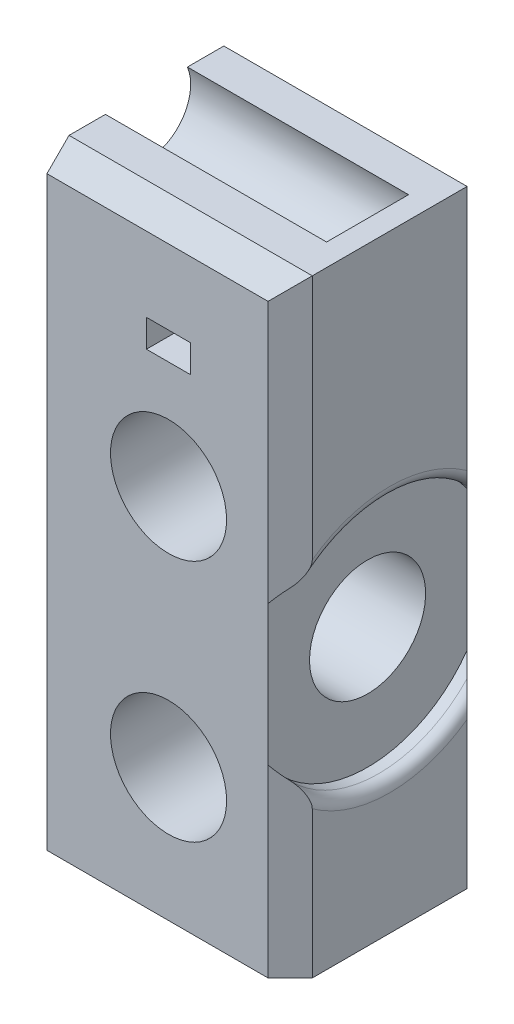
ISO-10303-21;
HEADER;
FILE_DESCRIPTION(('STEP AP214'),'2;1');
FILE_NAME('part.step','',(''),(''),'','','');
FILE_SCHEMA(('AUTOMOTIVE_DESIGN { 1 0 10303 214 1 1 1 1 }'));
ENDSEC;
DATA;
#1=APPLICATION_CONTEXT('core data for automotive mechanical design processes');
#2=APPLICATION_PROTOCOL_DEFINITION('international standard','automotive_design',2000,#1);
#3=PRODUCT_CONTEXT('',#1,'mechanical');
#4=PRODUCT('Part','Part','',(#3));
#5=PRODUCT_RELATED_PRODUCT_CATEGORY('part','',(#4));
#6=PRODUCT_DEFINITION_FORMATION('','',#4);
#7=PRODUCT_DEFINITION_CONTEXT('part definition',#1,'design');
#8=PRODUCT_DEFINITION('design','',#6,#7);
#9=PRODUCT_DEFINITION_SHAPE('','',#8);
#10=(LENGTH_UNIT() NAMED_UNIT(*) SI_UNIT(.MILLI.,.METRE.));
#11=(NAMED_UNIT(*) PLANE_ANGLE_UNIT() SI_UNIT($,.RADIAN.));
#12=(NAMED_UNIT(*) SI_UNIT($,.STERADIAN.) SOLID_ANGLE_UNIT());
#13=UNCERTAINTY_MEASURE_WITH_UNIT(LENGTH_MEASURE(1.E-05),#10,'distance_accuracy_value','');
#14=(GEOMETRIC_REPRESENTATION_CONTEXT(3) GLOBAL_UNCERTAINTY_ASSIGNED_CONTEXT((#13)) GLOBAL_UNIT_ASSIGNED_CONTEXT((#10,
#11,#12)) REPRESENTATION_CONTEXT('',''));
#15=CARTESIAN_POINT('',(0.,0.,0.));
#16=DIRECTION('',(0.,0.,1.));
#17=DIRECTION('',(1.,0.,0.));
#18=AXIS2_PLACEMENT_3D('',#15,#16,#17);
#19=CARTESIAN_POINT('',(22.,55.,-18.));
#20=DIRECTION('',(1.,0.,0.));
#21=DIRECTION('',(0.,1.,0.));
#22=AXIS2_PLACEMENT_3D('',#19,#20,#21);
#23=PLANE('',#22);
#24=DIRECTION('',(0.,1.,0.));
#25=VECTOR('',#24,1.);
#26=CARTESIAN_POINT('',(22.,55.,-16.));
#27=LINE('',#26,#25);
#28=CARTESIAN_POINT('',(22.,0.,-16.));
#29=VERTEX_POINT('',#28);
#30=CARTESIAN_POINT('',(22.,13.253205655191,-16.));
#31=VERTEX_POINT('',#30);
#32=EDGE_CURVE('E291',#29,#31,#27,.T.);
#33=ORIENTED_EDGE('',*,*,#32,.T.);
#34=CARTESIAN_POINT('',(22.,23.,-9.));
#35=DIRECTION('',(1.,0.,0.));
#36=DIRECTION('',(0.,1.,0.));
#37=AXIS2_PLACEMENT_3D('',#34,#35,#36);
#38=CIRCLE('',#37,12.);
#39=CARTESIAN_POINT('',(22.,13.253205655191,-2.));
#40=VERTEX_POINT('',#39);
#41=EDGE_CURVE('E346',#31,#40,#38,.F.);
#42=ORIENTED_EDGE('',*,*,#41,.T.);
#43=DIRECTION('',(0.,-1.,0.));
#44=VECTOR('',#43,1.);
#45=CARTESIAN_POINT('',(22.,0.,-2.));
#46=LINE('',#45,#44);
#47=CARTESIAN_POINT('',(22.,0.,-2.));
#48=VERTEX_POINT('',#47);
#49=EDGE_CURVE('E294',#40,#48,#46,.T.);
#50=ORIENTED_EDGE('',*,*,#49,.T.);
#51=DIRECTION('',(0.,0.,1.));
#52=VECTOR('',#51,1.);
#53=CARTESIAN_POINT('',(22.,0.,-18.));
#54=LINE('',#53,#52);
#55=EDGE_CURVE('E269',#29,#48,#54,.T.);
#56=ORIENTED_EDGE('',*,*,#55,.F.);
#57=EDGE_LOOP('',(#33,#42,#50,#56));
#58=FACE_BOUND('',#57,.T.);
#59=ADVANCED_FACE('F33',(#58),#23,.T.);
#60=CARTESIAN_POINT('',(22.,23.,-9.));
#61=DIRECTION('',(-1.,0.,0.));
#62=DIRECTION('',(0.,0.,1.));
#63=AXIS2_PLACEMENT_3D('',#60,#61,#62);
#64=CYLINDRICAL_SURFACE('',#63,5.25);
#65=CARTESIAN_POINT('',(0.,23.,-9.));
#66=DIRECTION('',(-1.,0.,0.));
#67=DIRECTION('',(0.,0.,1.));
#68=AXIS2_PLACEMENT_3D('',#65,#66,#67);
#69=CIRCLE('',#68,5.25);
#70=CARTESIAN_POINT('',(0.,23.,-3.75));
#71=VERTEX_POINT('',#70);
#72=EDGE_CURVE('E213',#71,#71,#69,.T.);
#73=ORIENTED_EDGE('',*,*,#72,.T.);
#74=EDGE_LOOP('',(#73));
#75=FACE_BOUND('',#74,.T.);
#76=CARTESIAN_POINT('',(20.,23.,-9.));
#77=DIRECTION('',(1.,0.,0.));
#78=DIRECTION('',(0.,1.,0.));
#79=AXIS2_PLACEMENT_3D('',#76,#77,#78);
#80=CIRCLE('',#79,5.25);
#81=CARTESIAN_POINT('',(20.,28.25,-9.));
#82=VERTEX_POINT('',#81);
#83=EDGE_CURVE('E204',#82,#82,#80,.F.);
#84=ORIENTED_EDGE('',*,*,#83,.F.);
#85=EDGE_LOOP('',(#84));
#86=FACE_BOUND('',#85,.T.);
#87=ADVANCED_FACE('F422',(#75,#86),#64,.F.);
#88=CARTESIAN_POINT('',(20.,0.,0.));
#89=DIRECTION('',(0.707106781186547,0.,0.707106781186547));
#90=DIRECTION('',(0.,-1.,0.));
#91=AXIS2_PLACEMENT_3D('',#88,#89,#90);
#92=PLANE('',#91);
#93=CARTESIAN_POINT('',(22.,55.,-2.));
#94=VERTEX_POINT('',#93);
#95=CARTESIAN_POINT('',(22.,32.746794344809,-2.));
#96=VERTEX_POINT('',#95);
#97=EDGE_CURVE('E295',#94,#96,#46,.T.);
#98=ORIENTED_EDGE('',*,*,#97,.F.);
#99=DIRECTION('',(-0.577350269189626,-0.577350269189626,0.577350269189626));
#100=VECTOR('',#99,1.);
#101=CARTESIAN_POINT('',(2.33333333333333,35.3333333333333,17.6666666666667));
#102=LINE('',#101,#100);
#103=CARTESIAN_POINT('',(20.,53.,0.));
#104=VERTEX_POINT('',#103);
#105=EDGE_CURVE('E193',#94,#104,#102,.T.);
#106=ORIENTED_EDGE('',*,*,#105,.T.);
#107=DIRECTION('',(0.,1.,0.));
#108=VECTOR('',#107,1.);
#109=CARTESIAN_POINT('',(20.,55.,0.));
#110=LINE('',#109,#108);
#111=CARTESIAN_POINT('',(20.,29.3245553203368,0.));
#112=VERTEX_POINT('',#111);
#113=EDGE_CURVE('E189',#112,#104,#110,.T.);
#114=ORIENTED_EDGE('',*,*,#113,.F.);
#115=CARTESIAN_POINT('',(29.,23.,-9.));
#116=DIRECTION('',(0.707106781186547,0.,0.707106781186547));
#117=DIRECTION('',(0.707106781186548,0.,-0.707106781186548));
#118=AXIS2_PLACEMENT_3D('',#115,#116,#117);
#119=ELLIPSE('',#118,15.556349186104,11.);
#120=CARTESIAN_POINT('',(21.,30.5498344352707,-1.));
#121=VERTEX_POINT('',#120);
#122=EDGE_CURVE('E163',#121,#112,#119,.T.);
#123=ORIENTED_EDGE('',*,*,#122,.F.);
#124=CARTESIAN_POINT('',(21.,30.5498344352707,-1.));
#125=CARTESIAN_POINT('',(21.0332176135886,30.585064994914,-1.03321761358859));
#126=CARTESIAN_POINT('',(21.0657876698333,30.6214904361269,-1.06578766983327));
#127=CARTESIAN_POINT('',(21.1296907284546,30.6964247989814,-1.12969072845465));
#128=CARTESIAN_POINT('',(21.1610241294047,30.7349330396946,-1.16102412940468));
#129=CARTESIAN_POINT('',(21.2225662198118,30.8137920041694,-1.22256621981178));
#130=CARTESIAN_POINT('',(21.2527736748636,30.8541446480475,-1.25277367486355));
#131=CARTESIAN_POINT('',(21.3120508322264,30.936491495134,-1.31205083222637));
#132=CARTESIAN_POINT('',(21.3411204143429,30.9784858708286,-1.34112041434287));
#133=CARTESIAN_POINT('',(21.4284872172308,31.1095504235047,-1.4284872172308));
#134=CARTESIAN_POINT('',(21.4849314885361,31.2011136728666,-1.4849314885361));
#135=CARTESIAN_POINT('',(21.5924553828394,31.3902900198901,-1.59245538283941));
#136=CARTESIAN_POINT('',(21.6435381199897,31.4878995526911,-1.64353811998971));
#137=CARTESIAN_POINT('',(21.7151613631439,31.6388504493364,-1.71516136314389));
#138=CARTESIAN_POINT('',(21.7381763382616,31.689856149284,-1.73817633826164));
#139=CARTESIAN_POINT('',(21.7823152121075,31.7934766769594,-1.78231521210748));
#140=CARTESIAN_POINT('',(21.8034394753193,31.8460911919112,-1.80343947531927));
#141=CARTESIAN_POINT('',(21.8432402072119,31.9523909218027,-1.84324020721191));
#142=CARTESIAN_POINT('',(21.8619415594864,32.0060574101105,-1.8619415594864));
#143=CARTESIAN_POINT('',(21.8967282497245,32.1150911017184,-1.89672824972446));
#144=CARTESIAN_POINT('',(21.912813262641,32.1704585153227,-1.912813262641));
#145=CARTESIAN_POINT('',(21.9379333744935,32.2681114008908,-1.93793337449351));
#146=CARTESIAN_POINT('',(21.9477105280514,32.3100135477502,-1.94771052805144));
#147=CARTESIAN_POINT('',(21.9651460272096,32.3946516707107,-1.96514602720966));
#148=CARTESIAN_POINT('',(21.9728066198218,32.437386710566,-1.97280661982184));
#149=CARTESIAN_POINT('',(21.9856804132807,32.5242125734738,-1.98568041328068));
#150=CARTESIAN_POINT('',(21.990859728662,32.5683138673928,-1.99085972866196));
#151=CARTESIAN_POINT('',(21.998011297161,32.6571729856846,-1.99801129716099));
#152=CARTESIAN_POINT('',(21.9999724442009,32.7019325480048,-1.99997244420087));
#153=CARTESIAN_POINT('',(22.0000000000003,32.7467943448088,-2.0000000000003));
#154=B_SPLINE_CURVE_WITH_KNOTS('',3,(#124,#125,#126,#127,#128,#129,#130,#131,#132,#133,#134,
#135,#136,#137,#138,#139,#140,#141,#142,#143,#144,#145,#146,#147,#148,#149,#150,#151,#152,#153),
.UNSPECIFIED.,.F.,.F.,(4,2,2,2,2,2,2,2,2,2,2,2,2,2,4),(0.,0.176116808033184,0.352176382297849,
0.528423614930732,0.704689414751418,1.06872647211663,1.43255090103852,1.61400469609854,
1.79542343555763,1.97479942559849,2.15419768384199,2.28647951427238,2.41862036550403,
2.55251769680534,2.68687615081373),.UNSPECIFIED.);
#155=EDGE_CURVE('E309',#121,#96,#154,.T.);
#156=ORIENTED_EDGE('',*,*,#155,.T.);
#157=EDGE_LOOP('',(#98,#106,#114,#123,#156));
#158=FACE_BOUND('',#157,.T.);
#159=ADVANCED_FACE('F191',(#158),#92,.T.);
#160=CARTESIAN_POINT('',(22.,55.,-16.));
#161=DIRECTION('',(-0.707106781186547,0.,0.707106781186547));
#162=DIRECTION('',(0.,1.,0.));
#163=AXIS2_PLACEMENT_3D('',#160,#161,#162);
#164=PLANE('',#163);
#165=CARTESIAN_POINT('',(29.,23.,-9.));
#166=DIRECTION('',(-0.707106781186547,0.,0.707106781186547));
#167=DIRECTION('',(0.707106781186548,0.,0.707106781186548));
#168=AXIS2_PLACEMENT_3D('',#165,#166,#167);
#169=ELLIPSE('',#168,15.556349186104,11.);
#170=CARTESIAN_POINT('',(21.,15.4501655647293,-17.));
#171=VERTEX_POINT('',#170);
#172=CARTESIAN_POINT('',(20.,16.6754446796632,-18.));
#173=VERTEX_POINT('',#172);
#174=EDGE_CURVE('E307',#171,#173,#169,.F.);
#175=ORIENTED_EDGE('',*,*,#174,.F.);
#176=CARTESIAN_POINT('',(21.,15.4501655647293,-17.));
#177=CARTESIAN_POINT('',(21.0332176135886,15.414935005086,-16.9667823864114));
#178=CARTESIAN_POINT('',(21.0657876698333,15.3785095638731,-16.9342123301667));
#179=CARTESIAN_POINT('',(21.1296907284546,15.3035752010186,-16.8703092715454));
#180=CARTESIAN_POINT('',(21.1610241294047,15.2650669603054,-16.8389758705953));
#181=CARTESIAN_POINT('',(21.2225662198118,15.1862079958306,-16.7774337801882));
#182=CARTESIAN_POINT('',(21.2527736748636,15.1458553519525,-16.7472263251364));
#183=CARTESIAN_POINT('',(21.3120508322264,15.063508504866,-16.6879491677736));
#184=CARTESIAN_POINT('',(21.3411204143429,15.0215141291714,-16.6588795856571));
#185=CARTESIAN_POINT('',(21.4284872172308,14.8904495764953,-16.5715127827692));
#186=CARTESIAN_POINT('',(21.4849314885361,14.7988863271334,-16.5150685114639));
#187=CARTESIAN_POINT('',(21.5924553828394,14.6097099801099,-16.4075446171606));
#188=CARTESIAN_POINT('',(21.6435381199897,14.5121004473089,-16.3564618800103));
#189=CARTESIAN_POINT('',(21.7151613631439,14.3611495506636,-16.2848386368561));
#190=CARTESIAN_POINT('',(21.7381763382616,14.310143850716,-16.2618236617384));
#191=CARTESIAN_POINT('',(21.7823152121075,14.2065233230406,-16.2176847878925));
#192=CARTESIAN_POINT('',(21.8034394753193,14.1539088080888,-16.1965605246807));
#193=CARTESIAN_POINT('',(21.8432402072119,14.0476090781973,-16.1567597927881));
#194=CARTESIAN_POINT('',(21.8619415594864,13.9939425898895,-16.1380584405136));
#195=CARTESIAN_POINT('',(21.8967282497245,13.8849088982816,-16.1032717502755));
#196=CARTESIAN_POINT('',(21.912813262641,13.8295414846773,-16.087186737359));
#197=CARTESIAN_POINT('',(21.9379333744935,13.7318885991092,-16.0620666255065));
#198=CARTESIAN_POINT('',(21.9477105280514,13.6899864522498,-16.0522894719486));
#199=CARTESIAN_POINT('',(21.9651460272097,13.6053483292893,-16.0348539727903));
#200=CARTESIAN_POINT('',(21.9728066198218,13.562613289434,-16.0271933801782));
#201=CARTESIAN_POINT('',(21.9856804132807,13.4757874265262,-16.0143195867193));
#202=CARTESIAN_POINT('',(21.990859728662,13.4316861326072,-16.009140271338));
#203=CARTESIAN_POINT('',(21.998011297161,13.3428270143154,-16.001988702839));
#204=CARTESIAN_POINT('',(21.9999724442009,13.2980674519952,-16.0000275557991));
#205=CARTESIAN_POINT('',(22.0000000000003,13.2532056551912,-15.9999999999997));
#206=B_SPLINE_CURVE_WITH_KNOTS('',3,(#176,#177,#178,#179,#180,#181,#182,#183,#184,#185,#186,
#187,#188,#189,#190,#191,#192,#193,#194,#195,#196,#197,#198,#199,#200,#201,#202,#203,#204,#205),
.UNSPECIFIED.,.F.,.F.,(4,2,2,2,2,2,2,2,2,2,2,2,2,2,4),(0.,0.176116808033185,0.35217638229785,
0.528423614930733,0.70468941475142,1.06872647211664,1.43255090103853,1.61400469609854,
1.79542343555763,1.9747994255985,2.154197683842,2.28647951427239,2.41862036550404,
2.55251769680535,2.68687615081374),.UNSPECIFIED.);
#207=EDGE_CURVE('E341',#171,#31,#206,.T.);
#208=ORIENTED_EDGE('',*,*,#207,.T.);
#209=ORIENTED_EDGE('',*,*,#32,.F.);
#210=DIRECTION('',(-0.707106781186548,0.,-0.707106781186548));
#211=VECTOR('',#210,1.);
#212=CARTESIAN_POINT('',(21.,0.,-17.));
#213=LINE('',#212,#211);
#214=CARTESIAN_POINT('',(20.,0.,-18.));
#215=VERTEX_POINT('',#214);
#216=EDGE_CURVE('E298',#215,#29,#213,.F.);
#217=ORIENTED_EDGE('',*,*,#216,.F.);
#218=DIRECTION('',(0.,-1.,0.));
#219=VECTOR('',#218,1.);
#220=CARTESIAN_POINT('',(20.,0.,-18.));
#221=LINE('',#220,#219);
#222=EDGE_CURVE('E302',#173,#215,#221,.T.);
#223=ORIENTED_EDGE('',*,*,#222,.F.);
#224=EDGE_LOOP('',(#175,#208,#209,#217,#223));
#225=FACE_BOUND('',#224,.T.);
#226=ADVANCED_FACE('F396',(#225),#164,.F.);
#227=CARTESIAN_POINT('',(0.,0.,-18.));
#228=DIRECTION('',(-1.,0.,0.));
#229=DIRECTION('',(0.,0.,1.));
#230=AXIS2_PLACEMENT_3D('',#227,#228,#229);
#231=PLANE('',#230);
#232=ORIENTED_EDGE('',*,*,#72,.F.);
#233=EDGE_LOOP('',(#232));
#234=FACE_BOUND('',#233,.T.);
#235=DIRECTION('',(0.,-1.,0.));
#236=VECTOR('',#235,1.);
#237=CARTESIAN_POINT('',(0.,0.,0.));
#238=LINE('',#237,#236);
#239=CARTESIAN_POINT('',(0.,53.,0.));
#240=VERTEX_POINT('',#239);
#241=CARTESIAN_POINT('',(0.,0.,0.));
#242=VERTEX_POINT('',#241);
#243=EDGE_CURVE('E267',#240,#242,#238,.T.);
#244=ORIENTED_EDGE('',*,*,#243,.F.);
#245=DIRECTION('',(0.,0.707106781186548,-0.707106781186548));
#246=VECTOR('',#245,1.);
#247=CARTESIAN_POINT('',(0.,35.5,17.5));
#248=LINE('',#247,#246);
#249=CARTESIAN_POINT('',(0.,55.,-2.00000000000001));
#250=VERTEX_POINT('',#249);
#251=EDGE_CURVE('E356',#240,#250,#248,.T.);
#252=ORIENTED_EDGE('',*,*,#251,.T.);
#253=DIRECTION('',(0.,0.,1.));
#254=VECTOR('',#253,1.);
#255=CARTESIAN_POINT('',(0.,55.,-18.));
#256=LINE('',#255,#254);
#257=CARTESIAN_POINT('',(0.,55.,-5.29190075645216));
#258=VERTEX_POINT('',#257);
#259=EDGE_CURVE('E278',#258,#250,#256,.T.);
#260=ORIENTED_EDGE('',*,*,#259,.F.);
#261=CARTESIAN_POINT('',(0.,53.5,-9.));
#262=DIRECTION('',(1.,0.,0.));
#263=DIRECTION('',(0.,0.,-1.));
#264=AXIS2_PLACEMENT_3D('',#261,#262,#263);
#265=CIRCLE('',#264,4.00000000000001);
#266=CARTESIAN_POINT('',(0.,55.,-12.7080992435478));
#267=VERTEX_POINT('',#266);
#268=EDGE_CURVE('E173',#258,#267,#265,.T.);
#269=ORIENTED_EDGE('',*,*,#268,.T.);
#270=CARTESIAN_POINT('',(0.,55.,-16.));
#271=VERTEX_POINT('',#270);
#272=EDGE_CURVE('E276',#271,#267,#256,.T.);
#273=ORIENTED_EDGE('',*,*,#272,.F.);
#274=DIRECTION('',(0.,0.707106781186548,0.707106781186548));
#275=VECTOR('',#274,1.);
#276=CARTESIAN_POINT('',(0.,26.5,-44.5));
#277=LINE('',#276,#275);
#278=CARTESIAN_POINT('',(0.,53.,-18.));
#279=VERTEX_POINT('',#278);
#280=EDGE_CURVE('E55',#271,#279,#277,.F.);
#281=ORIENTED_EDGE('',*,*,#280,.T.);
#282=DIRECTION('',(0.,-1.,0.));
#283=VECTOR('',#282,1.);
#284=CARTESIAN_POINT('',(0.,0.,-18.));
#285=LINE('',#284,#283);
#286=CARTESIAN_POINT('',(0.,0.,-18.));
#287=VERTEX_POINT('',#286);
#288=EDGE_CURVE('E266',#279,#287,#285,.T.);
#289=ORIENTED_EDGE('',*,*,#288,.T.);
#290=DIRECTION('',(0.,0.,1.));
#291=VECTOR('',#290,1.);
#292=CARTESIAN_POINT('',(0.,0.,-18.));
#293=LINE('',#292,#291);
#294=EDGE_CURVE('E272',#287,#242,#293,.T.);
#295=ORIENTED_EDGE('',*,*,#294,.T.);
#296=EDGE_LOOP('',(#244,#252,#260,#269,#273,#281,#289,#295));
#297=FACE_BOUND('',#296,.T.);
#298=ADVANCED_FACE('F378',(#234,#297),#231,.T.);
#299=CARTESIAN_POINT('',(0.,55.,-18.));
#300=DIRECTION('',(0.,1.,0.));
#301=DIRECTION('',(0.,0.,1.));
#302=AXIS2_PLACEMENT_3D('',#299,#300,#301);
#303=PLANE('',#302);
#304=ORIENTED_EDGE('',*,*,#259,.T.);
#305=DIRECTION('',(1.,0.,0.));
#306=VECTOR('',#305,1.);
#307=CARTESIAN_POINT('',(20.,55.,-2.00000000000001));
#308=LINE('',#307,#306);
#309=EDGE_CURVE('E361',#250,#94,#308,.T.);
#310=ORIENTED_EDGE('',*,*,#309,.T.);
#311=DIRECTION('',(0.,0.,1.));
#312=VECTOR('',#311,1.);
#313=CARTESIAN_POINT('',(22.,55.,-18.));
#314=LINE('',#313,#312);
#315=CARTESIAN_POINT('',(22.,55.,-16.));
#316=VERTEX_POINT('',#315);
#317=EDGE_CURVE('E279',#316,#94,#314,.T.);
#318=ORIENTED_EDGE('',*,*,#317,.F.);
#319=DIRECTION('',(-1.,0.,0.));
#320=VECTOR('',#319,1.);
#321=CARTESIAN_POINT('',(0.,55.,-16.));
#322=LINE('',#321,#320);
#323=EDGE_CURVE('E358',#316,#271,#322,.T.);
#324=ORIENTED_EDGE('',*,*,#323,.T.);
#325=ORIENTED_EDGE('',*,*,#272,.T.);
#326=DIRECTION('',(-1.,0.,0.));
#327=VECTOR('',#326,1.);
#328=CARTESIAN_POINT('',(20.,55.,-12.7080992435478));
#329=LINE('',#328,#327);
#330=CARTESIAN_POINT('',(20.,55.,-12.7080992435478));
#331=VERTEX_POINT('',#330);
#332=EDGE_CURVE('E198',#267,#331,#329,.F.);
#333=ORIENTED_EDGE('',*,*,#332,.T.);
#334=DIRECTION('',(0.,0.,-1.));
#335=VECTOR('',#334,1.);
#336=CARTESIAN_POINT('',(20.,55.,-18.));
#337=LINE('',#336,#335);
#338=CARTESIAN_POINT('',(20.,55.,-5.29190075645216));
#339=VERTEX_POINT('',#338);
#340=EDGE_CURVE('E275',#339,#331,#337,.T.);
#341=ORIENTED_EDGE('',*,*,#340,.F.);
#342=DIRECTION('',(-1.,0.,0.));
#343=VECTOR('',#342,1.);
#344=CARTESIAN_POINT('',(20.,55.,-5.29190075645216));
#345=LINE('',#344,#343);
#346=EDGE_CURVE('E285',#339,#258,#345,.T.);
#347=ORIENTED_EDGE('',*,*,#346,.T.);
#348=EDGE_LOOP('',(#304,#310,#318,#324,#325,#333,#341,#347));
#349=FACE_BOUND('',#348,.T.);
#350=ADVANCED_FACE('F367',(#349),#303,.T.);
#351=CARTESIAN_POINT('',(22.,0.,-18.));
#352=DIRECTION('',(0.,-1.,0.));
#353=DIRECTION('',(1.,0.,0.));
#354=AXIS2_PLACEMENT_3D('',#351,#352,#353);
#355=PLANE('',#354);
#356=ORIENTED_EDGE('',*,*,#55,.T.);
#357=DIRECTION('',(-0.707106781186548,0.,0.707106781186548));
#358=VECTOR('',#357,1.);
#359=CARTESIAN_POINT('',(30.,0.,-10.));
#360=LINE('',#359,#358);
#361=CARTESIAN_POINT('',(20.,0.,0.));
#362=VERTEX_POINT('',#361);
#363=EDGE_CURVE('E300',#48,#362,#360,.T.);
#364=ORIENTED_EDGE('',*,*,#363,.T.);
#365=DIRECTION('',(1.,0.,0.));
#366=VECTOR('',#365,1.);
#367=CARTESIAN_POINT('',(22.,0.,0.));
#368=LINE('',#367,#366);
#369=EDGE_CURVE('E260',#242,#362,#368,.T.);
#370=ORIENTED_EDGE('',*,*,#369,.F.);
#371=ORIENTED_EDGE('',*,*,#294,.F.);
#372=DIRECTION('',(1.,0.,0.));
#373=VECTOR('',#372,1.);
#374=CARTESIAN_POINT('',(22.,0.,-18.));
#375=LINE('',#374,#373);
#376=EDGE_CURVE('E263',#287,#215,#375,.T.);
#377=ORIENTED_EDGE('',*,*,#376,.T.);
#378=ORIENTED_EDGE('',*,*,#216,.T.);
#379=EDGE_LOOP('',(#356,#364,#370,#371,#377,#378));
#380=FACE_BOUND('',#379,.T.);
#381=ADVANCED_FACE('F383',(#380),#355,.T.);
#382=ORIENTED_EDGE('',*,*,#97,.T.);
#383=CARTESIAN_POINT('',(22.,23.,-9.));
#384=DIRECTION('',(1.,0.,0.));
#385=DIRECTION('',(0.,1.,0.));
#386=AXIS2_PLACEMENT_3D('',#383,#384,#385);
#387=CIRCLE('',#386,12.);
#388=CARTESIAN_POINT('',(22.,32.746794344809,-16.));
#389=VERTEX_POINT('',#388);
#390=EDGE_CURVE('E316',#96,#389,#387,.F.);
#391=ORIENTED_EDGE('',*,*,#390,.T.);
#392=EDGE_CURVE('E290',#389,#316,#27,.T.);
#393=ORIENTED_EDGE('',*,*,#392,.T.);
#394=ORIENTED_EDGE('',*,*,#317,.T.);
#395=EDGE_LOOP('',(#382,#391,#393,#394));
#396=FACE_BOUND('',#395,.T.);
#397=ADVANCED_FACE('F373',(#396),#23,.T.);
#398=CARTESIAN_POINT('',(0.,0.,-18.));
#399=DIRECTION('',(0.,0.,-1.));
#400=DIRECTION('',(-1.,0.,0.));
#401=AXIS2_PLACEMENT_3D('',#398,#399,#400);
#402=PLANE('',#401);
#403=DIRECTION('',(0.,-1.,0.));
#404=VECTOR('',#403,1.);
#405=CARTESIAN_POINT('',(9.,43.75,-18.));
#406=LINE('',#405,#404);
#407=CARTESIAN_POINT('',(9.,46.25,-18.));
#408=VERTEX_POINT('',#407);
#409=CARTESIAN_POINT('',(9.,43.75,-18.));
#410=VERTEX_POINT('',#409);
#411=EDGE_CURVE('E219',#408,#410,#406,.T.);
#412=ORIENTED_EDGE('',*,*,#411,.T.);
#413=DIRECTION('',(1.,0.,0.));
#414=VECTOR('',#413,1.);
#415=CARTESIAN_POINT('',(13.,43.75,-18.));
#416=LINE('',#415,#414);
#417=CARTESIAN_POINT('',(13.,43.75,-18.));
#418=VERTEX_POINT('',#417);
#419=EDGE_CURVE('E222',#410,#418,#416,.T.);
#420=ORIENTED_EDGE('',*,*,#419,.T.);
#421=DIRECTION('',(0.,1.,0.));
#422=VECTOR('',#421,1.);
#423=CARTESIAN_POINT('',(13.,43.75,-18.));
#424=LINE('',#423,#422);
#425=CARTESIAN_POINT('',(13.,46.25,-18.));
#426=VERTEX_POINT('',#425);
#427=EDGE_CURVE('E226',#418,#426,#424,.T.);
#428=ORIENTED_EDGE('',*,*,#427,.T.);
#429=DIRECTION('',(-1.,0.,0.));
#430=VECTOR('',#429,1.);
#431=CARTESIAN_POINT('',(13.,46.25,-18.));
#432=LINE('',#431,#430);
#433=EDGE_CURVE('E229',#426,#408,#432,.T.);
#434=ORIENTED_EDGE('',*,*,#433,.T.);
#435=EDGE_LOOP('',(#412,#420,#428,#434));
#436=FACE_BOUND('',#435,.T.);
#437=CARTESIAN_POINT('',(11.,34.,-18.));
#438=DIRECTION('',(0.,0.,1.));
#439=DIRECTION('',(1.,0.,0.));
#440=AXIS2_PLACEMENT_3D('',#437,#438,#439);
#441=CIRCLE('',#440,5.25);
#442=CARTESIAN_POINT('',(16.25,34.,-18.));
#443=VERTEX_POINT('',#442);
#444=EDGE_CURVE('E251',#443,#443,#441,.T.);
#445=ORIENTED_EDGE('',*,*,#444,.T.);
#446=EDGE_LOOP('',(#445));
#447=FACE_BOUND('',#446,.T.);
#448=CARTESIAN_POINT('',(11.,12.,-18.));
#449=DIRECTION('',(0.,0.,1.));
#450=DIRECTION('',(1.,0.,0.));
#451=AXIS2_PLACEMENT_3D('',#448,#449,#450);
#452=CIRCLE('',#451,5.25);
#453=CARTESIAN_POINT('',(16.25,12.,-18.));
#454=VERTEX_POINT('',#453);
#455=EDGE_CURVE('E257',#454,#454,#452,.T.);
#456=ORIENTED_EDGE('',*,*,#455,.T.);
#457=EDGE_LOOP('',(#456));
#458=FACE_BOUND('',#457,.T.);
#459=ORIENTED_EDGE('',*,*,#288,.F.);
#460=DIRECTION('',(1.,0.,0.));
#461=VECTOR('',#460,1.);
#462=CARTESIAN_POINT('',(0.,53.,-18.));
#463=LINE('',#462,#461);
#464=CARTESIAN_POINT('',(20.,53.,-18.));
#465=VERTEX_POINT('',#464);
#466=EDGE_CURVE('E41',#279,#465,#463,.T.);
#467=ORIENTED_EDGE('',*,*,#466,.T.);
#468=CARTESIAN_POINT('',(20.,29.3245553203368,-18.));
#469=VERTEX_POINT('',#468);
#470=EDGE_CURVE('E303',#465,#469,#221,.T.);
#471=ORIENTED_EDGE('',*,*,#470,.T.);
#472=EDGE_CURVE('E185',#469,#173,#221,.T.);
#473=ORIENTED_EDGE('',*,*,#472,.T.);
#474=ORIENTED_EDGE('',*,*,#222,.T.);
#475=ORIENTED_EDGE('',*,*,#376,.F.);
#476=EDGE_LOOP('',(#459,#467,#471,#473,#474,#475));
#477=FACE_BOUND('',#476,.T.);
#478=ADVANCED_FACE('F401',(#436,#447,#458,#477),#402,.T.);
#479=CARTESIAN_POINT('',(0.,0.,0.));
#480=DIRECTION('',(0.,0.,-1.));
#481=DIRECTION('',(-1.,0.,0.));
#482=AXIS2_PLACEMENT_3D('',#479,#480,#481);
#483=PLANE('',#482);
#484=DIRECTION('',(1.,0.,0.));
#485=VECTOR('',#484,1.);
#486=CARTESIAN_POINT('',(13.,43.75,0.));
#487=LINE('',#486,#485);
#488=CARTESIAN_POINT('',(9.,43.75,0.));
#489=VERTEX_POINT('',#488);
#490=CARTESIAN_POINT('',(13.,43.75,0.));
#491=VERTEX_POINT('',#490);
#492=EDGE_CURVE('E234',#489,#491,#487,.T.);
#493=ORIENTED_EDGE('',*,*,#492,.F.);
#494=DIRECTION('',(0.,-1.,0.));
#495=VECTOR('',#494,1.);
#496=CARTESIAN_POINT('',(9.,43.75,0.));
#497=LINE('',#496,#495);
#498=CARTESIAN_POINT('',(9.,46.25,0.));
#499=VERTEX_POINT('',#498);
#500=EDGE_CURVE('E218',#499,#489,#497,.T.);
#501=ORIENTED_EDGE('',*,*,#500,.F.);
#502=DIRECTION('',(-1.,0.,0.));
#503=VECTOR('',#502,1.);
#504=CARTESIAN_POINT('',(13.,46.25,0.));
#505=LINE('',#504,#503);
#506=CARTESIAN_POINT('',(13.,46.25,0.));
#507=VERTEX_POINT('',#506);
#508=EDGE_CURVE('E223',#507,#499,#505,.T.);
#509=ORIENTED_EDGE('',*,*,#508,.F.);
#510=DIRECTION('',(0.,1.,0.));
#511=VECTOR('',#510,1.);
#512=CARTESIAN_POINT('',(13.,43.75,0.));
#513=LINE('',#512,#511);
#514=EDGE_CURVE('E237',#491,#507,#513,.T.);
#515=ORIENTED_EDGE('',*,*,#514,.F.);
#516=EDGE_LOOP('',(#493,#501,#509,#515));
#517=FACE_BOUND('',#516,.T.);
#518=CARTESIAN_POINT('',(11.,34.,0.));
#519=DIRECTION('',(0.,0.,1.));
#520=DIRECTION('',(1.,0.,0.));
#521=AXIS2_PLACEMENT_3D('',#518,#519,#520);
#522=CIRCLE('',#521,5.25);
#523=CARTESIAN_POINT('',(16.25,34.,0.));
#524=VERTEX_POINT('',#523);
#525=EDGE_CURVE('E244',#524,#524,#522,.T.);
#526=ORIENTED_EDGE('',*,*,#525,.F.);
#527=EDGE_LOOP('',(#526));
#528=FACE_BOUND('',#527,.T.);
#529=CARTESIAN_POINT('',(11.,12.,0.));
#530=DIRECTION('',(0.,0.,1.));
#531=DIRECTION('',(1.,0.,0.));
#532=AXIS2_PLACEMENT_3D('',#529,#530,#531);
#533=CIRCLE('',#532,5.25);
#534=CARTESIAN_POINT('',(16.25,12.,0.));
#535=VERTEX_POINT('',#534);
#536=EDGE_CURVE('E254',#535,#535,#533,.T.);
#537=ORIENTED_EDGE('',*,*,#536,.F.);
#538=EDGE_LOOP('',(#537));
#539=FACE_BOUND('',#538,.T.);
#540=ORIENTED_EDGE('',*,*,#113,.T.);
#541=DIRECTION('',(-1.,0.,0.));
#542=VECTOR('',#541,1.);
#543=CARTESIAN_POINT('',(0.,53.,0.));
#544=LINE('',#543,#542);
#545=EDGE_CURVE('E353',#104,#240,#544,.T.);
#546=ORIENTED_EDGE('',*,*,#545,.T.);
#547=ORIENTED_EDGE('',*,*,#243,.T.);
#548=ORIENTED_EDGE('',*,*,#369,.T.);
#549=CARTESIAN_POINT('',(20.,16.6754446796632,0.));
#550=VERTEX_POINT('',#549);
#551=EDGE_CURVE('E197',#362,#550,#110,.T.);
#552=ORIENTED_EDGE('',*,*,#551,.T.);
#553=DIRECTION('',(0.,1.,0.));
#554=VECTOR('',#553,1.);
#555=CARTESIAN_POINT('',(20.,0.,0.));
#556=LINE('',#555,#554);
#557=EDGE_CURVE('E182',#550,#112,#556,.T.);
#558=ORIENTED_EDGE('',*,*,#557,.T.);
#559=EDGE_LOOP('',(#540,#546,#547,#548,#552,#558));
#560=FACE_BOUND('',#559,.T.);
#561=ADVANCED_FACE('F201',(#517,#528,#539,#560),#483,.F.);
#562=CARTESIAN_POINT('',(11.,12.,-18.));
#563=DIRECTION('',(0.,0.,1.));
#564=DIRECTION('',(1.,0.,0.));
#565=AXIS2_PLACEMENT_3D('',#562,#563,#564);
#566=CYLINDRICAL_SURFACE('',#565,5.25);
#567=ORIENTED_EDGE('',*,*,#455,.F.);
#568=EDGE_LOOP('',(#567));
#569=FACE_BOUND('',#568,.T.);
#570=ORIENTED_EDGE('',*,*,#536,.T.);
#571=EDGE_LOOP('',(#570));
#572=FACE_BOUND('',#571,.T.);
#573=ADVANCED_FACE('F447',(#569,#572),#566,.F.);
#574=CARTESIAN_POINT('',(11.,34.,-18.));
#575=DIRECTION('',(0.,0.,1.));
#576=DIRECTION('',(1.,0.,0.));
#577=AXIS2_PLACEMENT_3D('',#574,#575,#576);
#578=CYLINDRICAL_SURFACE('',#577,5.25);
#579=ORIENTED_EDGE('',*,*,#444,.F.);
#580=EDGE_LOOP('',(#579));
#581=FACE_BOUND('',#580,.T.);
#582=ORIENTED_EDGE('',*,*,#525,.T.);
#583=EDGE_LOOP('',(#582));
#584=FACE_BOUND('',#583,.T.);
#585=ADVANCED_FACE('F452',(#581,#584),#578,.F.);
#586=CARTESIAN_POINT('',(9.,43.75,-18.));
#587=DIRECTION('',(-1.,0.,0.));
#588=DIRECTION('',(0.,0.,1.));
#589=AXIS2_PLACEMENT_3D('',#586,#587,#588);
#590=PLANE('',#589);
#591=ORIENTED_EDGE('',*,*,#500,.T.);
#592=DIRECTION('',(0.,0.,1.));
#593=VECTOR('',#592,1.);
#594=CARTESIAN_POINT('',(9.,43.75,-18.));
#595=LINE('',#594,#593);
#596=EDGE_CURVE('E232',#410,#489,#595,.T.);
#597=ORIENTED_EDGE('',*,*,#596,.F.);
#598=ORIENTED_EDGE('',*,*,#411,.F.);
#599=DIRECTION('',(0.,0.,1.));
#600=VECTOR('',#599,1.);
#601=CARTESIAN_POINT('',(9.,46.25,-18.));
#602=LINE('',#601,#600);
#603=EDGE_CURVE('E242',#408,#499,#602,.T.);
#604=ORIENTED_EDGE('',*,*,#603,.T.);
#605=EDGE_LOOP('',(#591,#597,#598,#604));
#606=FACE_BOUND('',#605,.T.);
#607=ADVANCED_FACE('F456',(#606),#590,.F.);
#608=CARTESIAN_POINT('',(13.,46.25,-18.));
#609=DIRECTION('',(0.,1.,0.));
#610=DIRECTION('',(0.,0.,1.));
#611=AXIS2_PLACEMENT_3D('',#608,#609,#610);
#612=PLANE('',#611);
#613=ORIENTED_EDGE('',*,*,#508,.T.);
#614=ORIENTED_EDGE('',*,*,#603,.F.);
#615=ORIENTED_EDGE('',*,*,#433,.F.);
#616=DIRECTION('',(0.,0.,1.));
#617=VECTOR('',#616,1.);
#618=CARTESIAN_POINT('',(13.,46.25,-18.));
#619=LINE('',#618,#617);
#620=EDGE_CURVE('E245',#426,#507,#619,.T.);
#621=ORIENTED_EDGE('',*,*,#620,.T.);
#622=EDGE_LOOP('',(#613,#614,#615,#621));
#623=FACE_BOUND('',#622,.T.);
#624=ADVANCED_FACE('F460',(#623),#612,.F.);
#625=CARTESIAN_POINT('',(13.,43.75,-18.));
#626=DIRECTION('',(1.,0.,0.));
#627=DIRECTION('',(0.,0.,-1.));
#628=AXIS2_PLACEMENT_3D('',#625,#626,#627);
#629=PLANE('',#628);
#630=ORIENTED_EDGE('',*,*,#514,.T.);
#631=ORIENTED_EDGE('',*,*,#620,.F.);
#632=ORIENTED_EDGE('',*,*,#427,.F.);
#633=DIRECTION('',(0.,0.,1.));
#634=VECTOR('',#633,1.);
#635=CARTESIAN_POINT('',(13.,43.75,-18.));
#636=LINE('',#635,#634);
#637=EDGE_CURVE('E247',#418,#491,#636,.T.);
#638=ORIENTED_EDGE('',*,*,#637,.T.);
#639=EDGE_LOOP('',(#630,#631,#632,#638));
#640=FACE_BOUND('',#639,.T.);
#641=ADVANCED_FACE('F464',(#640),#629,.F.);
#642=CARTESIAN_POINT('',(13.,43.75,-18.));
#643=DIRECTION('',(0.,-1.,0.));
#644=DIRECTION('',(0.,0.,-1.));
#645=AXIS2_PLACEMENT_3D('',#642,#643,#644);
#646=PLANE('',#645);
#647=ORIENTED_EDGE('',*,*,#492,.T.);
#648=ORIENTED_EDGE('',*,*,#637,.F.);
#649=ORIENTED_EDGE('',*,*,#419,.F.);
#650=ORIENTED_EDGE('',*,*,#596,.T.);
#651=EDGE_LOOP('',(#647,#648,#649,#650));
#652=FACE_BOUND('',#651,.T.);
#653=ADVANCED_FACE('F418',(#652),#646,.F.);
#654=CARTESIAN_POINT('',(20.,53.5,-9.));
#655=DIRECTION('',(-1.,0.,0.));
#656=DIRECTION('',(0.,0.,1.));
#657=AXIS2_PLACEMENT_3D('',#654,#655,#656);
#658=CYLINDRICAL_SURFACE('',#657,4.00000000000001);
#659=ORIENTED_EDGE('',*,*,#268,.F.);
#660=ORIENTED_EDGE('',*,*,#346,.F.);
#661=CARTESIAN_POINT('',(20.,53.5,-9.));
#662=DIRECTION('',(1.,0.,0.));
#663=DIRECTION('',(0.,0.,-1.));
#664=AXIS2_PLACEMENT_3D('',#661,#662,#663);
#665=CIRCLE('',#664,4.00000000000001);
#666=EDGE_CURVE('E210',#339,#331,#665,.T.);
#667=ORIENTED_EDGE('',*,*,#666,.T.);
#668=ORIENTED_EDGE('',*,*,#332,.F.);
#669=EDGE_LOOP('',(#659,#660,#667,#668));
#670=FACE_BOUND('',#669,.T.);
#671=ADVANCED_FACE('F408',(#670),#658,.F.);
#672=CARTESIAN_POINT('',(20.,53.5,-9.));
#673=DIRECTION('',(1.,0.,0.));
#674=DIRECTION('',(0.,0.,-1.));
#675=AXIS2_PLACEMENT_3D('',#672,#673,#674);
#676=PLANE('',#675);
#677=ORIENTED_EDGE('',*,*,#340,.T.);
#678=ORIENTED_EDGE('',*,*,#666,.F.);
#679=EDGE_LOOP('',(#677,#678));
#680=FACE_BOUND('',#679,.T.);
#681=ADVANCED_FACE('F411',(#680),#676,.F.);
#682=ORIENTED_EDGE('',*,*,#49,.F.);
#683=CARTESIAN_POINT('',(22.,13.253205655191,-2.));
#684=CARTESIAN_POINT('',(21.9999766560589,13.2962494065844,-1.99997665605888));
#685=CARTESIAN_POINT('',(21.998168932567,13.3392046752749,-1.99816893256702));
#686=CARTESIAN_POINT('',(21.9915552740378,13.4245221746565,-1.99155527403784));
#687=CARTESIAN_POINT('',(21.9867591186859,13.4668858807151,-1.98675911868589));
#688=CARTESIAN_POINT('',(21.9748086996764,13.5503501680223,-1.9748086996764));
#689=CARTESIAN_POINT('',(21.9676854202024,13.5914599774481,-1.96768542020239));
#690=CARTESIAN_POINT('',(21.9514453132439,13.672921209684,-1.9514453132439));
#691=CARTESIAN_POINT('',(21.9423263790877,13.7132717817659,-1.94232637908766));
#692=CARTESIAN_POINT('',(21.9147003673617,13.8240830671392,-1.91470036736176));
#693=CARTESIAN_POINT('',(21.894393919011,13.8936478109954,-1.89439391901098));
#694=CARTESIAN_POINT('',(21.8497664484496,14.0301221547315,-1.84976644844958));
#695=CARTESIAN_POINT('',(21.825443875575,14.097030716608,-1.82544387557505));
#696=CARTESIAN_POINT('',(21.773230307304,14.2292233628306,-1.77323030730403));
#697=CARTESIAN_POINT('',(21.745293972196,14.2944714096261,-1.74529397219603));
#698=CARTESIAN_POINT('',(21.6866995403245,14.4224549238955,-1.68669954032451));
#699=CARTESIAN_POINT('',(21.6560414777441,14.4851904229111,-1.65604147774414));
#700=CARTESIAN_POINT('',(21.5794002500722,14.6333387857842,-1.57940025007221));
#701=CARTESIAN_POINT('',(21.532267142803,14.717563060593,-1.53226714280303));
#702=CARTESIAN_POINT('',(21.4339923432625,14.8812081236913,-1.43399234326249));
#703=CARTESIAN_POINT('',(21.3828501468935,14.960628305689,-1.38285014689354));
#704=CARTESIAN_POINT('',(21.3041551442489,15.0746009576611,-1.30415514424889));
#705=CARTESIAN_POINT('',(21.2780448503946,15.1111619630403,-1.27804485039457));
#706=CARTESIAN_POINT('',(21.2249304815896,15.182959076026,-1.22493048158956));
#707=CARTESIAN_POINT('',(21.1979264852834,15.2181952996316,-1.19792648528338));
#708=CARTESIAN_POINT('',(21.1430075043079,15.2872078811779,-1.14300750430787));
#709=CARTESIAN_POINT('',(21.1150926855419,15.3209845024041,-1.11509268554193));
#710=CARTESIAN_POINT('',(21.0582885241414,15.3868773390111,-1.05828852414139));
#711=CARTESIAN_POINT('',(21.0293989201956,15.4189931032271,-1.02939892019566));
#712=CARTESIAN_POINT('',(21.0000000000019,15.4501655647312,-1.00000000000186));
#713=B_SPLINE_CURVE_WITH_KNOTS('',3,(#683,#684,#685,#686,#687,#688,#689,#690,#691,#692,#693,
#694,#695,#696,#697,#698,#699,#700,#701,#702,#703,#704,#705,#706,#707,#708,#709,#710,#711,#712),
.UNSPECIFIED.,.F.,.F.,(4,2,2,2,2,2,2,2,2,2,2,2,2,2,4),(0.,0.128932655520978,0.257445577252772,
0.38431277755064,0.511314554203528,0.736726127634834,0.962224939014591,1.1908923769881,
1.41955694345176,1.74149862121284,2.06348084462767,2.21934538260824,2.37519624101844,
2.53101886844988,2.68688360447958),.UNSPECIFIED.);
#714=CARTESIAN_POINT('',(21.,15.4501655647293,-0.999999999999992));
#715=VERTEX_POINT('',#714);
#716=EDGE_CURVE('E348',#40,#715,#713,.T.);
#717=ORIENTED_EDGE('',*,*,#716,.T.);
#718=EDGE_CURVE('E174',#550,#715,#119,.T.);
#719=ORIENTED_EDGE('',*,*,#718,.F.);
#720=ORIENTED_EDGE('',*,*,#551,.F.);
#721=ORIENTED_EDGE('',*,*,#363,.F.);
#722=EDGE_LOOP('',(#682,#717,#719,#720,#721));
#723=FACE_BOUND('',#722,.T.);
#724=ADVANCED_FACE('F318',(#723),#92,.T.);
#725=ORIENTED_EDGE('',*,*,#470,.F.);
#726=DIRECTION('',(0.577350269189626,0.577350269189626,0.577350269189626));
#727=VECTOR('',#726,1.);
#728=CARTESIAN_POINT('',(22.,55.,-16.));
#729=LINE('',#728,#727);
#730=EDGE_CURVE('E11',#465,#316,#729,.T.);
#731=ORIENTED_EDGE('',*,*,#730,.T.);
#732=ORIENTED_EDGE('',*,*,#392,.F.);
#733=CARTESIAN_POINT('',(22.,32.746794344809,-16.));
#734=CARTESIAN_POINT('',(21.9999766560589,32.7037505934156,-16.0000233439411));
#735=CARTESIAN_POINT('',(21.998168932567,32.6607953247251,-16.001831067433));
#736=CARTESIAN_POINT('',(21.9915552740378,32.5754778253435,-16.0084447259622));
#737=CARTESIAN_POINT('',(21.9867591186859,32.5331141192849,-16.0132408813141));
#738=CARTESIAN_POINT('',(21.9748086996764,32.4496498319777,-16.0251913003236));
#739=CARTESIAN_POINT('',(21.9676854202024,32.4085400225519,-16.0323145797976));
#740=CARTESIAN_POINT('',(21.9514453132439,32.327078790316,-16.0485546867561));
#741=CARTESIAN_POINT('',(21.9423263790877,32.2867282182341,-16.0576736209123));
#742=CARTESIAN_POINT('',(21.9147003673617,32.1759169328608,-16.0852996326382));
#743=CARTESIAN_POINT('',(21.894393919011,32.1063521890046,-16.105606080989));
#744=CARTESIAN_POINT('',(21.8497664484496,31.9698778452685,-16.1502335515504));
#745=CARTESIAN_POINT('',(21.825443875575,31.902969283392,-16.174556124425));
#746=CARTESIAN_POINT('',(21.773230307304,31.7707766371694,-16.226769692696));
#747=CARTESIAN_POINT('',(21.745293972196,31.7055285903739,-16.254706027804));
#748=CARTESIAN_POINT('',(21.6866995403245,31.5775450761045,-16.3133004596755));
#749=CARTESIAN_POINT('',(21.6560414777441,31.5148095770889,-16.3439585222559));
#750=CARTESIAN_POINT('',(21.5794002500722,31.3666612142158,-16.4205997499278));
#751=CARTESIAN_POINT('',(21.532267142803,31.282436939407,-16.467732857197));
#752=CARTESIAN_POINT('',(21.4339923432625,31.1187918763087,-16.5660076567375));
#753=CARTESIAN_POINT('',(21.3828501468935,31.039371694311,-16.6171498531065));
#754=CARTESIAN_POINT('',(21.3041551442489,30.9253990423389,-16.6958448557511));
#755=CARTESIAN_POINT('',(21.2780448503946,30.8888380369597,-16.7219551496054));
#756=CARTESIAN_POINT('',(21.2249304815896,30.817040923974,-16.7750695184104));
#757=CARTESIAN_POINT('',(21.1979264852834,30.7818047003684,-16.8020735147166));
#758=CARTESIAN_POINT('',(21.1430075043079,30.7127921188221,-16.8569924956921));
#759=CARTESIAN_POINT('',(21.1150926855419,30.6790154975959,-16.8849073144581));
#760=CARTESIAN_POINT('',(21.0582885241414,30.6131226609889,-16.9417114758586));
#761=CARTESIAN_POINT('',(21.0293989201957,30.5810068967729,-16.9706010798043));
#762=CARTESIAN_POINT('',(21.0000000000019,30.5498344352688,-16.9999999999981));
#763=B_SPLINE_CURVE_WITH_KNOTS('',3,(#733,#734,#735,#736,#737,#738,#739,#740,#741,#742,#743,
#744,#745,#746,#747,#748,#749,#750,#751,#752,#753,#754,#755,#756,#757,#758,#759,#760,#761,#762),
.UNSPECIFIED.,.F.,.F.,(4,2,2,2,2,2,2,2,2,2,2,2,2,2,4),(0.,0.12893265552098,0.257445577252776,
0.384312777550635,0.511314554203528,0.736726127634841,0.9622249390146,1.19089237698811,
1.41955694345176,1.74149862121284,2.06348084462767,2.21934538260823,2.37519624101844,
2.53101886844987,2.68688360447958),.UNSPECIFIED.);
#764=CARTESIAN_POINT('',(21.,30.5498344352707,-17.));
#765=VERTEX_POINT('',#764);
#766=EDGE_CURVE('E333',#389,#765,#763,.T.);
#767=ORIENTED_EDGE('',*,*,#766,.T.);
#768=EDGE_CURVE('E305',#469,#765,#169,.F.);
#769=ORIENTED_EDGE('',*,*,#768,.F.);
#770=EDGE_LOOP('',(#725,#731,#732,#767,#769));
#771=FACE_BOUND('',#770,.T.);
#772=ADVANCED_FACE('F329',(#771),#164,.F.);
#773=CARTESIAN_POINT('',(20.,23.,-9.));
#774=DIRECTION('',(1.,0.,0.));
#775=DIRECTION('',(0.,1.,0.));
#776=AXIS2_PLACEMENT_3D('',#773,#774,#775);
#777=CYLINDRICAL_SURFACE('',#776,11.);
#778=ORIENTED_EDGE('',*,*,#768,.T.);
#779=CARTESIAN_POINT('',(21.,23.,-9.));
#780=DIRECTION('',(1.,0.,0.));
#781=DIRECTION('',(0.,1.,0.));
#782=AXIS2_PLACEMENT_3D('',#779,#780,#781);
#783=CIRCLE('',#782,11.);
#784=EDGE_CURVE('E170',#765,#121,#783,.T.);
#785=ORIENTED_EDGE('',*,*,#784,.T.);
#786=ORIENTED_EDGE('',*,*,#122,.T.);
#787=CARTESIAN_POINT('',(20.,23.,-9.));
#788=DIRECTION('',(1.,0.,0.));
#789=DIRECTION('',(0.,1.,0.));
#790=AXIS2_PLACEMENT_3D('',#787,#788,#789);
#791=CIRCLE('',#790,11.);
#792=EDGE_CURVE('E167',#469,#112,#791,.T.);
#793=ORIENTED_EDGE('',*,*,#792,.F.);
#794=EDGE_LOOP('',(#778,#785,#786,#793));
#795=FACE_BOUND('',#794,.T.);
#796=ADVANCED_FACE('F166',(#795),#777,.F.);
#797=CARTESIAN_POINT('',(20.,23.,-9.));
#798=DIRECTION('',(1.,0.,0.));
#799=DIRECTION('',(0.,1.,0.));
#800=AXIS2_PLACEMENT_3D('',#797,#798,#799);
#801=PLANE('',#800);
#802=EDGE_CURVE('E186',#550,#173,#791,.T.);
#803=ORIENTED_EDGE('',*,*,#802,.T.);
#804=ORIENTED_EDGE('',*,*,#472,.F.);
#805=ORIENTED_EDGE('',*,*,#792,.T.);
#806=ORIENTED_EDGE('',*,*,#557,.F.);
#807=EDGE_LOOP('',(#803,#804,#805,#806));
#808=FACE_BOUND('',#807,.T.);
#809=ORIENTED_EDGE('',*,*,#83,.T.);
#810=EDGE_LOOP('',(#809));
#811=FACE_BOUND('',#810,.T.);
#812=ADVANCED_FACE('F179',(#808,#811),#801,.T.);
#813=ORIENTED_EDGE('',*,*,#718,.T.);
#814=CARTESIAN_POINT('',(21.,23.,-9.));
#815=DIRECTION('',(1.,0.,0.));
#816=DIRECTION('',(0.,1.,0.));
#817=AXIS2_PLACEMENT_3D('',#814,#815,#816);
#818=CIRCLE('',#817,11.);
#819=EDGE_CURVE('E338',#715,#171,#818,.T.);
#820=ORIENTED_EDGE('',*,*,#819,.T.);
#821=ORIENTED_EDGE('',*,*,#174,.T.);
#822=ORIENTED_EDGE('',*,*,#802,.F.);
#823=EDGE_LOOP('',(#813,#820,#821,#822));
#824=FACE_BOUND('',#823,.T.);
#825=ADVANCED_FACE('F327',(#824),#777,.F.);
#826=CARTESIAN_POINT('',(21.,23.,-9.));
#827=DIRECTION('',(1.,0.,0.));
#828=DIRECTION('',(0.,1.,0.));
#829=AXIS2_PLACEMENT_3D('',#826,#827,#828);
#830=TOROIDAL_SURFACE('',#829,12.,1.);
#831=ORIENTED_EDGE('',*,*,#766,.F.);
#832=ORIENTED_EDGE('',*,*,#390,.F.);
#833=ORIENTED_EDGE('',*,*,#155,.F.);
#834=ORIENTED_EDGE('',*,*,#784,.F.);
#835=EDGE_LOOP('',(#831,#832,#833,#834));
#836=FACE_BOUND('',#835,.T.);
#837=ADVANCED_FACE('F322',(#836),#830,.T.);
#838=CARTESIAN_POINT('',(21.,23.,-9.));
#839=DIRECTION('',(1.,0.,0.));
#840=DIRECTION('',(0.,1.,0.));
#841=AXIS2_PLACEMENT_3D('',#838,#839,#840);
#842=TOROIDAL_SURFACE('',#841,12.,1.);
#843=ORIENTED_EDGE('',*,*,#716,.F.);
#844=ORIENTED_EDGE('',*,*,#41,.F.);
#845=ORIENTED_EDGE('',*,*,#207,.F.);
#846=ORIENTED_EDGE('',*,*,#819,.F.);
#847=EDGE_LOOP('',(#843,#844,#845,#846));
#848=FACE_BOUND('',#847,.T.);
#849=ADVANCED_FACE('F326',(#848),#842,.T.);
#850=CARTESIAN_POINT('',(0.,53.,0.));
#851=DIRECTION('',(0.,0.707106781186548,0.707106781186548));
#852=DIRECTION('',(1.,0.,0.));
#853=AXIS2_PLACEMENT_3D('',#850,#851,#852);
#854=PLANE('',#853);
#855=ORIENTED_EDGE('',*,*,#105,.F.);
#856=ORIENTED_EDGE('',*,*,#309,.F.);
#857=ORIENTED_EDGE('',*,*,#251,.F.);
#858=ORIENTED_EDGE('',*,*,#545,.F.);
#859=EDGE_LOOP('',(#855,#856,#857,#858));
#860=FACE_BOUND('',#859,.T.);
#861=ADVANCED_FACE('F376',(#860),#854,.T.);
#862=CARTESIAN_POINT('',(0.,55.,-16.));
#863=DIRECTION('',(0.,-0.707106781186547,0.707106781186547));
#864=DIRECTION('',(-1.,0.,0.));
#865=AXIS2_PLACEMENT_3D('',#862,#863,#864);
#866=PLANE('',#865);
#867=ORIENTED_EDGE('',*,*,#730,.F.);
#868=ORIENTED_EDGE('',*,*,#466,.F.);
#869=ORIENTED_EDGE('',*,*,#280,.F.);
#870=ORIENTED_EDGE('',*,*,#323,.F.);
#871=EDGE_LOOP('',(#867,#868,#869,#870));
#872=FACE_BOUND('',#871,.T.);
#873=ADVANCED_FACE('F35',(#872),#866,.F.);
#874=CLOSED_SHELL('',(#59,#87,#159,#226,#298,#350,#381,#397,#478,#561,#573,#585,#607,#624,#641,
#653,#671,#681,#724,#772,#796,#812,#825,#837,#849,#861,#873));
#875=MANIFOLD_SOLID_BREP('B2',#874);
#876=ADVANCED_BREP_SHAPE_REPRESENTATION('',(#18,#875),#14);
#877=SHAPE_DEFINITION_REPRESENTATION(#9,#876);
ENDSEC;
END-ISO-10303-21;
